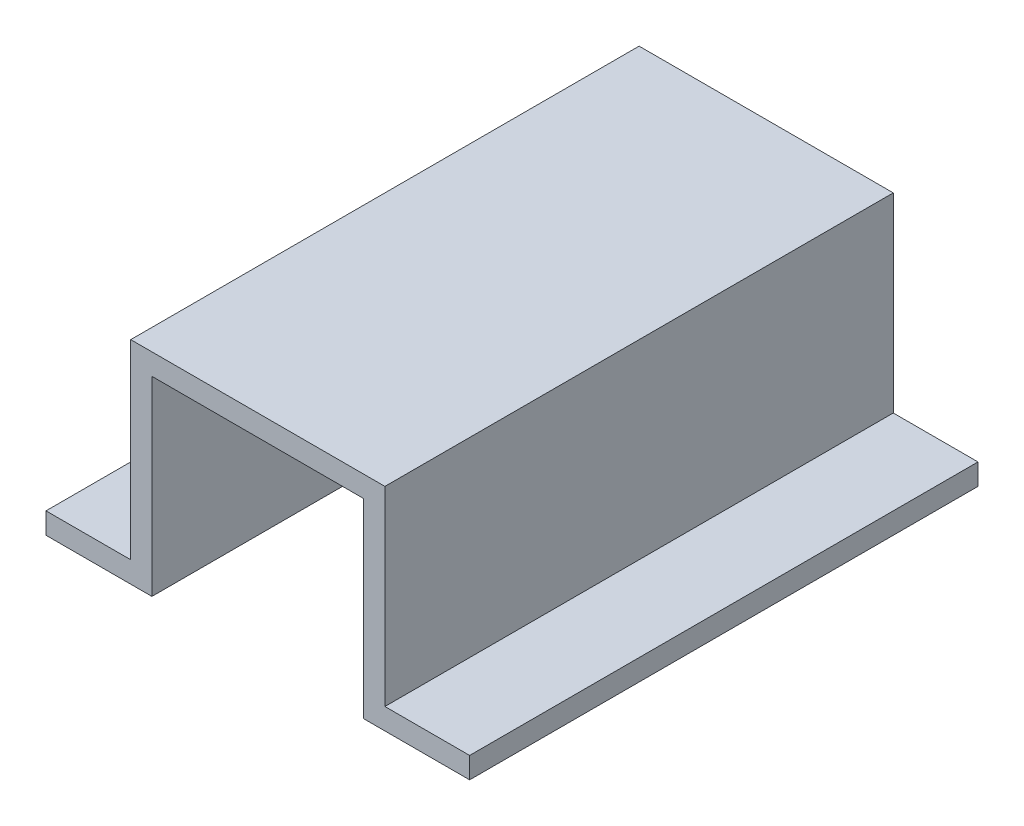
ISO-10303-21;
HEADER;
FILE_DESCRIPTION(('STEP AP214'),'2;1');
FILE_NAME('part.step','',(''),(''),'','','');
FILE_SCHEMA(('AUTOMOTIVE_DESIGN { 1 0 10303 214 1 1 1 1 }'));
ENDSEC;
DATA;
#1=APPLICATION_CONTEXT('core data for automotive mechanical design processes');
#2=APPLICATION_PROTOCOL_DEFINITION('international standard','automotive_design',2000,#1);
#3=PRODUCT_CONTEXT('',#1,'mechanical');
#4=PRODUCT('Part','Part','',(#3));
#5=PRODUCT_RELATED_PRODUCT_CATEGORY('part','',(#4));
#6=PRODUCT_DEFINITION_FORMATION('','',#4);
#7=PRODUCT_DEFINITION_CONTEXT('part definition',#1,'design');
#8=PRODUCT_DEFINITION('design','',#6,#7);
#9=PRODUCT_DEFINITION_SHAPE('','',#8);
#10=(LENGTH_UNIT() NAMED_UNIT(*) SI_UNIT(.MILLI.,.METRE.));
#11=(NAMED_UNIT(*) PLANE_ANGLE_UNIT() SI_UNIT($,.RADIAN.));
#12=(NAMED_UNIT(*) SI_UNIT($,.STERADIAN.) SOLID_ANGLE_UNIT());
#13=UNCERTAINTY_MEASURE_WITH_UNIT(LENGTH_MEASURE(1.E-05),#10,'distance_accuracy_value','');
#14=(GEOMETRIC_REPRESENTATION_CONTEXT(3) GLOBAL_UNCERTAINTY_ASSIGNED_CONTEXT((#13)) GLOBAL_UNIT_ASSIGNED_CONTEXT((#10,
#11,#12)) REPRESENTATION_CONTEXT('',''));
#15=CARTESIAN_POINT('',(0.,0.,0.));
#16=DIRECTION('',(0.,0.,1.));
#17=DIRECTION('',(1.,0.,0.));
#18=AXIS2_PLACEMENT_3D('',#15,#16,#17);
#19=CARTESIAN_POINT('',(5.,0.,24.));
#20=DIRECTION('',(0.,1.,0.));
#21=DIRECTION('',(0.,0.,1.));
#22=AXIS2_PLACEMENT_3D('',#19,#20,#21);
#23=PLANE('',#22);
#24=DIRECTION('',(1.,0.,0.));
#25=VECTOR('',#24,1.);
#26=CARTESIAN_POINT('',(5.,0.,0.));
#27=LINE('',#26,#25);
#28=CARTESIAN_POINT('',(5.,0.,0.));
#29=VERTEX_POINT('',#28);
#30=CARTESIAN_POINT('',(10.,0.,0.));
#31=VERTEX_POINT('',#30);
#32=EDGE_CURVE('E153',#29,#31,#27,.T.);
#33=ORIENTED_EDGE('',*,*,#32,.T.);
#34=DIRECTION('',(0.,0.,-1.));
#35=VECTOR('',#34,1.);
#36=CARTESIAN_POINT('',(10.,0.,24.));
#37=LINE('',#36,#35);
#38=CARTESIAN_POINT('',(10.,0.,24.));
#39=VERTEX_POINT('',#38);
#40=EDGE_CURVE('E11',#39,#31,#37,.T.);
#41=ORIENTED_EDGE('',*,*,#40,.F.);
#42=DIRECTION('',(1.,0.,0.));
#43=VECTOR('',#42,1.);
#44=CARTESIAN_POINT('',(5.,0.,24.));
#45=LINE('',#44,#43);
#46=CARTESIAN_POINT('',(5.,0.,24.));
#47=VERTEX_POINT('',#46);
#48=EDGE_CURVE('E175',#47,#39,#45,.T.);
#49=ORIENTED_EDGE('',*,*,#48,.F.);
#50=DIRECTION('',(0.,0.,-1.));
#51=VECTOR('',#50,1.);
#52=CARTESIAN_POINT('',(5.,0.,24.));
#53=LINE('',#52,#51);
#54=EDGE_CURVE('E149',#47,#29,#53,.T.);
#55=ORIENTED_EDGE('',*,*,#54,.T.);
#56=EDGE_LOOP('',(#33,#41,#49,#55));
#57=FACE_BOUND('',#56,.T.);
#58=ADVANCED_FACE('F33',(#57),#23,.F.);
#59=CARTESIAN_POINT('',(10.,0.,24.));
#60=DIRECTION('',(-1.,0.,0.));
#61=DIRECTION('',(0.,0.,1.));
#62=AXIS2_PLACEMENT_3D('',#59,#60,#61);
#63=PLANE('',#62);
#64=DIRECTION('',(0.,1.,0.));
#65=VECTOR('',#64,1.);
#66=CARTESIAN_POINT('',(10.,0.,0.));
#67=LINE('',#66,#65);
#68=CARTESIAN_POINT('',(10.,1.,0.));
#69=VERTEX_POINT('',#68);
#70=EDGE_CURVE('E156',#31,#69,#67,.T.);
#71=ORIENTED_EDGE('',*,*,#70,.T.);
#72=DIRECTION('',(0.,0.,-1.));
#73=VECTOR('',#72,1.);
#74=CARTESIAN_POINT('',(10.,1.,24.));
#75=LINE('',#74,#73);
#76=CARTESIAN_POINT('',(10.,1.,24.));
#77=VERTEX_POINT('',#76);
#78=EDGE_CURVE('E41',#77,#69,#75,.T.);
#79=ORIENTED_EDGE('',*,*,#78,.F.);
#80=DIRECTION('',(0.,1.,0.));
#81=VECTOR('',#80,1.);
#82=CARTESIAN_POINT('',(10.,0.,24.));
#83=LINE('',#82,#81);
#84=EDGE_CURVE('E104',#39,#77,#83,.T.);
#85=ORIENTED_EDGE('',*,*,#84,.F.);
#86=ORIENTED_EDGE('',*,*,#40,.T.);
#87=EDGE_LOOP('',(#71,#79,#85,#86));
#88=FACE_BOUND('',#87,.T.);
#89=ADVANCED_FACE('F253',(#88),#63,.F.);
#90=CARTESIAN_POINT('',(6.,1.,24.));
#91=DIRECTION('',(0.,-1.,0.));
#92=DIRECTION('',(0.,0.,-1.));
#93=AXIS2_PLACEMENT_3D('',#90,#91,#92);
#94=PLANE('',#93);
#95=DIRECTION('',(-1.,0.,0.));
#96=VECTOR('',#95,1.);
#97=CARTESIAN_POINT('',(6.,1.,0.));
#98=LINE('',#97,#96);
#99=CARTESIAN_POINT('',(6.,1.,0.));
#100=VERTEX_POINT('',#99);
#101=EDGE_CURVE('E158',#69,#100,#98,.T.);
#102=ORIENTED_EDGE('',*,*,#101,.T.);
#103=DIRECTION('',(0.,0.,-1.));
#104=VECTOR('',#103,1.);
#105=CARTESIAN_POINT('',(6.,1.,24.));
#106=LINE('',#105,#104);
#107=CARTESIAN_POINT('',(6.,1.,24.));
#108=VERTEX_POINT('',#107);
#109=EDGE_CURVE('E194',#108,#100,#106,.T.);
#110=ORIENTED_EDGE('',*,*,#109,.F.);
#111=DIRECTION('',(-1.,0.,0.));
#112=VECTOR('',#111,1.);
#113=CARTESIAN_POINT('',(6.,1.,24.));
#114=LINE('',#113,#112);
#115=EDGE_CURVE('E202',#77,#108,#114,.T.);
#116=ORIENTED_EDGE('',*,*,#115,.F.);
#117=ORIENTED_EDGE('',*,*,#78,.T.);
#118=EDGE_LOOP('',(#102,#110,#116,#117));
#119=FACE_BOUND('',#118,.T.);
#120=ADVANCED_FACE('F200',(#119),#94,.F.);
#121=CARTESIAN_POINT('',(6.,10.,24.));
#122=DIRECTION('',(-1.,0.,0.));
#123=DIRECTION('',(0.,-1.,0.));
#124=AXIS2_PLACEMENT_3D('',#121,#122,#123);
#125=PLANE('',#124);
#126=DIRECTION('',(0.,1.,0.));
#127=VECTOR('',#126,1.);
#128=CARTESIAN_POINT('',(6.,10.,0.));
#129=LINE('',#128,#127);
#130=CARTESIAN_POINT('',(6.,10.,0.));
#131=VERTEX_POINT('',#130);
#132=EDGE_CURVE('E160',#100,#131,#129,.T.);
#133=ORIENTED_EDGE('',*,*,#132,.T.);
#134=DIRECTION('',(0.,0.,-1.));
#135=VECTOR('',#134,1.);
#136=CARTESIAN_POINT('',(6.,10.,24.));
#137=LINE('',#136,#135);
#138=CARTESIAN_POINT('',(6.,10.,24.));
#139=VERTEX_POINT('',#138);
#140=EDGE_CURVE('E191',#139,#131,#137,.T.);
#141=ORIENTED_EDGE('',*,*,#140,.F.);
#142=DIRECTION('',(0.,1.,0.));
#143=VECTOR('',#142,1.);
#144=CARTESIAN_POINT('',(6.,10.,24.));
#145=LINE('',#144,#143);
#146=EDGE_CURVE('E220',#108,#139,#145,.T.);
#147=ORIENTED_EDGE('',*,*,#146,.F.);
#148=ORIENTED_EDGE('',*,*,#109,.T.);
#149=EDGE_LOOP('',(#133,#141,#147,#148));
#150=FACE_BOUND('',#149,.T.);
#151=ADVANCED_FACE('F211',(#150),#125,.F.);
#152=CARTESIAN_POINT('',(-6.,10.,24.));
#153=DIRECTION('',(0.,-1.,0.));
#154=DIRECTION('',(0.,0.,-1.));
#155=AXIS2_PLACEMENT_3D('',#152,#153,#154);
#156=PLANE('',#155);
#157=DIRECTION('',(-1.,0.,0.));
#158=VECTOR('',#157,1.);
#159=CARTESIAN_POINT('',(-6.,10.,0.));
#160=LINE('',#159,#158);
#161=CARTESIAN_POINT('',(-6.,10.,0.));
#162=VERTEX_POINT('',#161);
#163=EDGE_CURVE('E162',#131,#162,#160,.T.);
#164=ORIENTED_EDGE('',*,*,#163,.T.);
#165=DIRECTION('',(0.,0.,-1.));
#166=VECTOR('',#165,1.);
#167=CARTESIAN_POINT('',(-6.,10.,24.));
#168=LINE('',#167,#166);
#169=CARTESIAN_POINT('',(-6.,10.,24.));
#170=VERTEX_POINT('',#169);
#171=EDGE_CURVE('E188',#170,#162,#168,.T.);
#172=ORIENTED_EDGE('',*,*,#171,.F.);
#173=DIRECTION('',(-1.,0.,0.));
#174=VECTOR('',#173,1.);
#175=CARTESIAN_POINT('',(-6.,10.,24.));
#176=LINE('',#175,#174);
#177=EDGE_CURVE('E217',#139,#170,#176,.T.);
#178=ORIENTED_EDGE('',*,*,#177,.F.);
#179=ORIENTED_EDGE('',*,*,#140,.T.);
#180=EDGE_LOOP('',(#164,#172,#178,#179));
#181=FACE_BOUND('',#180,.T.);
#182=ADVANCED_FACE('F215',(#181),#156,.F.);
#183=CARTESIAN_POINT('',(-6.,10.,24.));
#184=DIRECTION('',(1.,0.,0.));
#185=DIRECTION('',(0.,0.,-1.));
#186=AXIS2_PLACEMENT_3D('',#183,#184,#185);
#187=PLANE('',#186);
#188=DIRECTION('',(0.,-1.,0.));
#189=VECTOR('',#188,1.);
#190=CARTESIAN_POINT('',(-6.,10.,0.));
#191=LINE('',#190,#189);
#192=CARTESIAN_POINT('',(-6.,1.,0.));
#193=VERTEX_POINT('',#192);
#194=EDGE_CURVE('E164',#162,#193,#191,.T.);
#195=ORIENTED_EDGE('',*,*,#194,.T.);
#196=DIRECTION('',(0.,0.,-1.));
#197=VECTOR('',#196,1.);
#198=CARTESIAN_POINT('',(-6.,1.,24.));
#199=LINE('',#198,#197);
#200=CARTESIAN_POINT('',(-6.,1.,24.));
#201=VERTEX_POINT('',#200);
#202=EDGE_CURVE('E185',#201,#193,#199,.T.);
#203=ORIENTED_EDGE('',*,*,#202,.F.);
#204=DIRECTION('',(0.,-1.,0.));
#205=VECTOR('',#204,1.);
#206=CARTESIAN_POINT('',(-6.,10.,24.));
#207=LINE('',#206,#205);
#208=EDGE_CURVE('E219',#170,#201,#207,.T.);
#209=ORIENTED_EDGE('',*,*,#208,.F.);
#210=ORIENTED_EDGE('',*,*,#171,.T.);
#211=EDGE_LOOP('',(#195,#203,#209,#210));
#212=FACE_BOUND('',#211,.T.);
#213=ADVANCED_FACE('F266',(#212),#187,.F.);
#214=CARTESIAN_POINT('',(-6.,1.,24.));
#215=DIRECTION('',(0.,-1.,0.));
#216=DIRECTION('',(0.,0.,-1.));
#217=AXIS2_PLACEMENT_3D('',#214,#215,#216);
#218=PLANE('',#217);
#219=DIRECTION('',(-1.,0.,0.));
#220=VECTOR('',#219,1.);
#221=CARTESIAN_POINT('',(-6.,1.,0.));
#222=LINE('',#221,#220);
#223=CARTESIAN_POINT('',(-9.99999999999999,1.,0.));
#224=VERTEX_POINT('',#223);
#225=EDGE_CURVE('E166',#193,#224,#222,.T.);
#226=ORIENTED_EDGE('',*,*,#225,.T.);
#227=DIRECTION('',(0.,0.,-1.));
#228=VECTOR('',#227,1.);
#229=CARTESIAN_POINT('',(-9.99999999999999,1.,24.));
#230=LINE('',#229,#228);
#231=CARTESIAN_POINT('',(-9.99999999999999,1.,24.));
#232=VERTEX_POINT('',#231);
#233=EDGE_CURVE('E182',#232,#224,#230,.T.);
#234=ORIENTED_EDGE('',*,*,#233,.F.);
#235=DIRECTION('',(-1.,0.,0.));
#236=VECTOR('',#235,1.);
#237=CARTESIAN_POINT('',(-6.,1.,24.));
#238=LINE('',#237,#236);
#239=EDGE_CURVE('E222',#201,#232,#238,.T.);
#240=ORIENTED_EDGE('',*,*,#239,.F.);
#241=ORIENTED_EDGE('',*,*,#202,.T.);
#242=EDGE_LOOP('',(#226,#234,#240,#241));
#243=FACE_BOUND('',#242,.T.);
#244=ADVANCED_FACE('F269',(#243),#218,.F.);
#245=CARTESIAN_POINT('',(-9.99999999999999,0.,24.));
#246=DIRECTION('',(1.,0.,0.));
#247=DIRECTION('',(0.,0.,-1.));
#248=AXIS2_PLACEMENT_3D('',#245,#246,#247);
#249=PLANE('',#248);
#250=DIRECTION('',(0.,-1.,0.));
#251=VECTOR('',#250,1.);
#252=CARTESIAN_POINT('',(-9.99999999999999,0.,0.));
#253=LINE('',#252,#251);
#254=CARTESIAN_POINT('',(-9.99999999999999,0.,0.));
#255=VERTEX_POINT('',#254);
#256=EDGE_CURVE('E168',#224,#255,#253,.T.);
#257=ORIENTED_EDGE('',*,*,#256,.T.);
#258=DIRECTION('',(0.,0.,-1.));
#259=VECTOR('',#258,1.);
#260=CARTESIAN_POINT('',(-9.99999999999999,0.,24.));
#261=LINE('',#260,#259);
#262=CARTESIAN_POINT('',(-9.99999999999999,0.,24.));
#263=VERTEX_POINT('',#262);
#264=EDGE_CURVE('E179',#263,#255,#261,.T.);
#265=ORIENTED_EDGE('',*,*,#264,.F.);
#266=DIRECTION('',(0.,-1.,0.));
#267=VECTOR('',#266,1.);
#268=CARTESIAN_POINT('',(-9.99999999999999,0.,24.));
#269=LINE('',#268,#267);
#270=EDGE_CURVE('E228',#232,#263,#269,.T.);
#271=ORIENTED_EDGE('',*,*,#270,.F.);
#272=ORIENTED_EDGE('',*,*,#233,.T.);
#273=EDGE_LOOP('',(#257,#265,#271,#272));
#274=FACE_BOUND('',#273,.T.);
#275=ADVANCED_FACE('F234',(#274),#249,.F.);
#276=CARTESIAN_POINT('',(-5.,0.,24.));
#277=DIRECTION('',(0.,1.,0.));
#278=DIRECTION('',(0.,0.,1.));
#279=AXIS2_PLACEMENT_3D('',#276,#277,#278);
#280=PLANE('',#279);
#281=DIRECTION('',(1.,0.,0.));
#282=VECTOR('',#281,1.);
#283=CARTESIAN_POINT('',(-5.,0.,0.));
#284=LINE('',#283,#282);
#285=CARTESIAN_POINT('',(-5.,0.,0.));
#286=VERTEX_POINT('',#285);
#287=EDGE_CURVE('E170',#255,#286,#284,.T.);
#288=ORIENTED_EDGE('',*,*,#287,.T.);
#289=DIRECTION('',(0.,0.,-1.));
#290=VECTOR('',#289,1.);
#291=CARTESIAN_POINT('',(-5.,0.,24.));
#292=LINE('',#291,#290);
#293=CARTESIAN_POINT('',(-5.,0.,24.));
#294=VERTEX_POINT('',#293);
#295=EDGE_CURVE('E144',#294,#286,#292,.T.);
#296=ORIENTED_EDGE('',*,*,#295,.F.);
#297=DIRECTION('',(1.,0.,0.));
#298=VECTOR('',#297,1.);
#299=CARTESIAN_POINT('',(-5.,0.,24.));
#300=LINE('',#299,#298);
#301=EDGE_CURVE('E135',#263,#294,#300,.T.);
#302=ORIENTED_EDGE('',*,*,#301,.F.);
#303=ORIENTED_EDGE('',*,*,#264,.T.);
#304=EDGE_LOOP('',(#288,#296,#302,#303));
#305=FACE_BOUND('',#304,.T.);
#306=ADVANCED_FACE('F238',(#305),#280,.F.);
#307=CARTESIAN_POINT('',(-5.,0.,24.));
#308=DIRECTION('',(-1.,0.,0.));
#309=DIRECTION('',(0.,-1.,0.));
#310=AXIS2_PLACEMENT_3D('',#307,#308,#309);
#311=PLANE('',#310);
#312=DIRECTION('',(0.,1.,0.));
#313=VECTOR('',#312,1.);
#314=CARTESIAN_POINT('',(-5.,0.,0.));
#315=LINE('',#314,#313);
#316=CARTESIAN_POINT('',(-5.,9.,0.));
#317=VERTEX_POINT('',#316);
#318=EDGE_CURVE('E143',#286,#317,#315,.T.);
#319=ORIENTED_EDGE('',*,*,#318,.T.);
#320=DIRECTION('',(0.,0.,-1.));
#321=VECTOR('',#320,1.);
#322=CARTESIAN_POINT('',(-5.,9.,24.));
#323=LINE('',#322,#321);
#324=CARTESIAN_POINT('',(-5.,9.,24.));
#325=VERTEX_POINT('',#324);
#326=EDGE_CURVE('E140',#325,#317,#323,.T.);
#327=ORIENTED_EDGE('',*,*,#326,.F.);
#328=DIRECTION('',(0.,1.,0.));
#329=VECTOR('',#328,1.);
#330=CARTESIAN_POINT('',(-5.,0.,24.));
#331=LINE('',#330,#329);
#332=EDGE_CURVE('E129',#294,#325,#331,.T.);
#333=ORIENTED_EDGE('',*,*,#332,.F.);
#334=ORIENTED_EDGE('',*,*,#295,.T.);
#335=EDGE_LOOP('',(#319,#327,#333,#334));
#336=FACE_BOUND('',#335,.T.);
#337=ADVANCED_FACE('F141',(#336),#311,.F.);
#338=CARTESIAN_POINT('',(5.,9.,24.));
#339=DIRECTION('',(0.,1.,0.));
#340=DIRECTION('',(0.,0.,1.));
#341=AXIS2_PLACEMENT_3D('',#338,#339,#340);
#342=PLANE('',#341);
#343=DIRECTION('',(1.,0.,0.));
#344=VECTOR('',#343,1.);
#345=CARTESIAN_POINT('',(5.,9.,0.));
#346=LINE('',#345,#344);
#347=CARTESIAN_POINT('',(5.,9.,0.));
#348=VERTEX_POINT('',#347);
#349=EDGE_CURVE('E90',#317,#348,#346,.T.);
#350=ORIENTED_EDGE('',*,*,#349,.T.);
#351=DIRECTION('',(0.,0.,-1.));
#352=VECTOR('',#351,1.);
#353=CARTESIAN_POINT('',(5.,9.,24.));
#354=LINE('',#353,#352);
#355=CARTESIAN_POINT('',(5.,9.,24.));
#356=VERTEX_POINT('',#355);
#357=EDGE_CURVE('E145',#356,#348,#354,.T.);
#358=ORIENTED_EDGE('',*,*,#357,.F.);
#359=DIRECTION('',(1.,0.,0.));
#360=VECTOR('',#359,1.);
#361=CARTESIAN_POINT('',(5.,9.,24.));
#362=LINE('',#361,#360);
#363=EDGE_CURVE('E133',#325,#356,#362,.T.);
#364=ORIENTED_EDGE('',*,*,#363,.F.);
#365=ORIENTED_EDGE('',*,*,#326,.T.);
#366=EDGE_LOOP('',(#350,#358,#364,#365));
#367=FACE_BOUND('',#366,.T.);
#368=ADVANCED_FACE('F147',(#367),#342,.F.);
#369=CARTESIAN_POINT('',(5.,0.,24.));
#370=DIRECTION('',(1.,0.,0.));
#371=DIRECTION('',(0.,1.,0.));
#372=AXIS2_PLACEMENT_3D('',#369,#370,#371);
#373=PLANE('',#372);
#374=DIRECTION('',(0.,-1.,0.));
#375=VECTOR('',#374,1.);
#376=CARTESIAN_POINT('',(5.,0.,0.));
#377=LINE('',#376,#375);
#378=EDGE_CURVE('E96',#348,#29,#377,.T.);
#379=ORIENTED_EDGE('',*,*,#378,.T.);
#380=ORIENTED_EDGE('',*,*,#54,.F.);
#381=DIRECTION('',(0.,-1.,0.));
#382=VECTOR('',#381,1.);
#383=CARTESIAN_POINT('',(5.,0.,24.));
#384=LINE('',#383,#382);
#385=EDGE_CURVE('E49',#356,#47,#384,.T.);
#386=ORIENTED_EDGE('',*,*,#385,.F.);
#387=ORIENTED_EDGE('',*,*,#357,.T.);
#388=EDGE_LOOP('',(#379,#380,#386,#387));
#389=FACE_BOUND('',#388,.T.);
#390=ADVANCED_FACE('F242',(#389),#373,.F.);
#391=CARTESIAN_POINT('',(0.,0.,24.));
#392=DIRECTION('',(0.,0.,1.));
#393=DIRECTION('',(1.,0.,0.));
#394=AXIS2_PLACEMENT_3D('',#391,#392,#393);
#395=PLANE('',#394);
#396=ORIENTED_EDGE('',*,*,#48,.T.);
#397=ORIENTED_EDGE('',*,*,#84,.T.);
#398=ORIENTED_EDGE('',*,*,#115,.T.);
#399=ORIENTED_EDGE('',*,*,#146,.T.);
#400=ORIENTED_EDGE('',*,*,#177,.T.);
#401=ORIENTED_EDGE('',*,*,#208,.T.);
#402=ORIENTED_EDGE('',*,*,#239,.T.);
#403=ORIENTED_EDGE('',*,*,#270,.T.);
#404=ORIENTED_EDGE('',*,*,#301,.T.);
#405=ORIENTED_EDGE('',*,*,#332,.T.);
#406=ORIENTED_EDGE('',*,*,#363,.T.);
#407=ORIENTED_EDGE('',*,*,#385,.T.);
#408=EDGE_LOOP('',(#396,#397,#398,#399,#400,#401,#402,#403,#404,#405,#406,#407));
#409=FACE_BOUND('',#408,.T.);
#410=ADVANCED_FACE('F131',(#409),#395,.T.);
#411=CARTESIAN_POINT('',(0.,0.,0.));
#412=DIRECTION('',(0.,0.,1.));
#413=DIRECTION('',(1.,0.,0.));
#414=AXIS2_PLACEMENT_3D('',#411,#412,#413);
#415=PLANE('',#414);
#416=ORIENTED_EDGE('',*,*,#32,.F.);
#417=ORIENTED_EDGE('',*,*,#378,.F.);
#418=ORIENTED_EDGE('',*,*,#349,.F.);
#419=ORIENTED_EDGE('',*,*,#318,.F.);
#420=ORIENTED_EDGE('',*,*,#287,.F.);
#421=ORIENTED_EDGE('',*,*,#256,.F.);
#422=ORIENTED_EDGE('',*,*,#225,.F.);
#423=ORIENTED_EDGE('',*,*,#194,.F.);
#424=ORIENTED_EDGE('',*,*,#163,.F.);
#425=ORIENTED_EDGE('',*,*,#132,.F.);
#426=ORIENTED_EDGE('',*,*,#101,.F.);
#427=ORIENTED_EDGE('',*,*,#70,.F.);
#428=EDGE_LOOP('',(#416,#417,#418,#419,#420,#421,#422,#423,#424,#425,#426,#427));
#429=FACE_BOUND('',#428,.T.);
#430=ADVANCED_FACE('F206',(#429),#415,.F.);
#431=CLOSED_SHELL('',(#58,#89,#120,#151,#182,#213,#244,#275,#306,#337,#368,#390,#410,#430));
#432=MANIFOLD_SOLID_BREP('B2',#431);
#433=ADVANCED_BREP_SHAPE_REPRESENTATION('',(#18,#432),#14);
#434=SHAPE_DEFINITION_REPRESENTATION(#9,#433);
ENDSEC;
END-ISO-10303-21;
